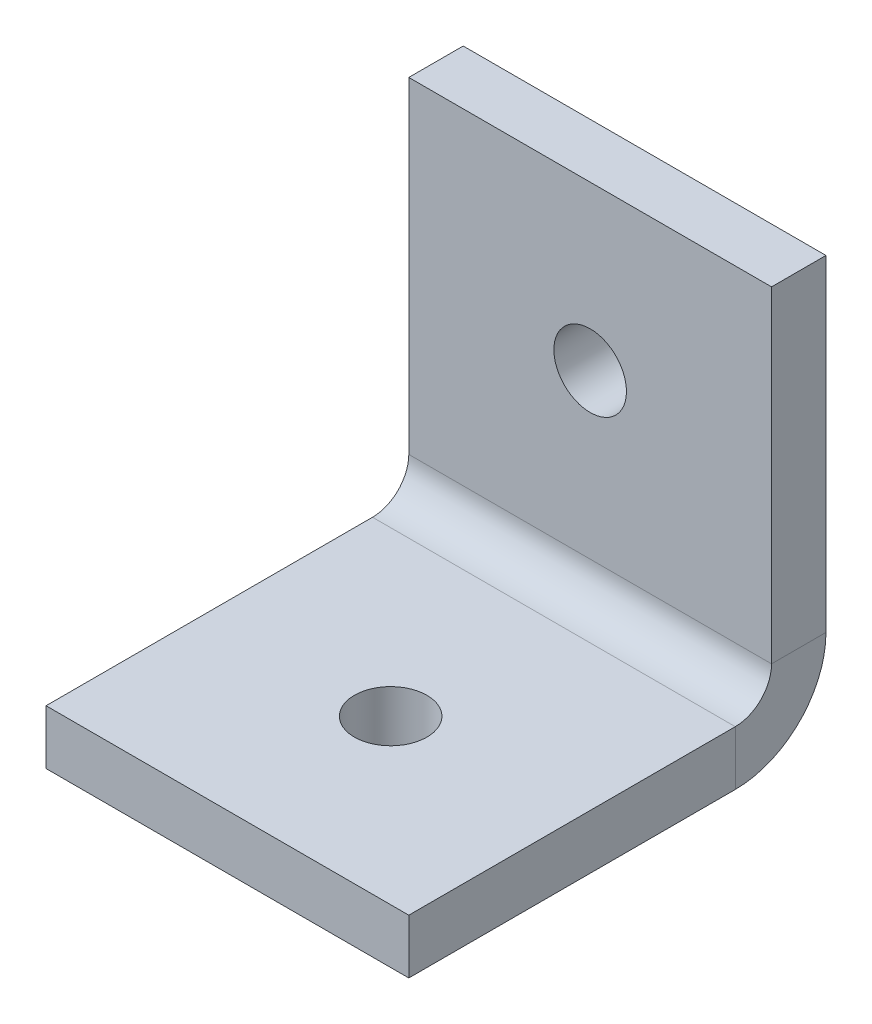
ISO-10303-21;
HEADER;
FILE_DESCRIPTION(('STEP AP214'),'2;1');
FILE_NAME('part.step','',(''),(''),'','','');
FILE_SCHEMA(('AUTOMOTIVE_DESIGN { 1 0 10303 214 1 1 1 1 }'));
ENDSEC;
DATA;
#1=APPLICATION_CONTEXT('core data for automotive mechanical design processes');
#2=APPLICATION_PROTOCOL_DEFINITION('international standard','automotive_design',2000,#1);
#3=PRODUCT_CONTEXT('',#1,'mechanical');
#4=PRODUCT('Part','Part','',(#3));
#5=PRODUCT_RELATED_PRODUCT_CATEGORY('part','',(#4));
#6=PRODUCT_DEFINITION_FORMATION('','',#4);
#7=PRODUCT_DEFINITION_CONTEXT('part definition',#1,'design');
#8=PRODUCT_DEFINITION('design','',#6,#7);
#9=PRODUCT_DEFINITION_SHAPE('','',#8);
#10=(LENGTH_UNIT() NAMED_UNIT(*) SI_UNIT(.MILLI.,.METRE.));
#11=(NAMED_UNIT(*) PLANE_ANGLE_UNIT() SI_UNIT($,.RADIAN.));
#12=(NAMED_UNIT(*) SI_UNIT($,.STERADIAN.) SOLID_ANGLE_UNIT());
#13=UNCERTAINTY_MEASURE_WITH_UNIT(LENGTH_MEASURE(1.E-05),#10,'distance_accuracy_value','');
#14=(GEOMETRIC_REPRESENTATION_CONTEXT(3) GLOBAL_UNCERTAINTY_ASSIGNED_CONTEXT((#13)) GLOBAL_UNIT_ASSIGNED_CONTEXT((#10,
#11,#12)) REPRESENTATION_CONTEXT('',''));
#15=CARTESIAN_POINT('',(0.,0.,0.));
#16=DIRECTION('',(0.,0.,1.));
#17=DIRECTION('',(1.,0.,0.));
#18=AXIS2_PLACEMENT_3D('',#15,#16,#17);
#19=CARTESIAN_POINT('',(20.,2.,0.));
#20=DIRECTION('',(1.,0.,0.));
#21=DIRECTION('',(0.,0.,-1.));
#22=AXIS2_PLACEMENT_3D('',#19,#20,#21);
#23=PLANE('',#22);
#24=DIRECTION('',(0.,0.,-1.));
#25=VECTOR('',#24,1.);
#26=CARTESIAN_POINT('',(20.,2.,0.));
#27=LINE('',#26,#25);
#28=CARTESIAN_POINT('',(20.,2.,0.));
#29=VERTEX_POINT('',#28);
#30=CARTESIAN_POINT('',(20.,2.,-3.));
#31=VERTEX_POINT('',#30);
#32=EDGE_CURVE('E11',#29,#31,#27,.T.);
#33=ORIENTED_EDGE('',*,*,#32,.F.);
#34=CARTESIAN_POINT('',(20.,2.,2.));
#35=DIRECTION('',(1.,0.,0.));
#36=DIRECTION('',(0.,0.,-1.));
#37=AXIS2_PLACEMENT_3D('',#34,#35,#36);
#38=CIRCLE('',#37,2.);
#39=CARTESIAN_POINT('',(20.,0.,2.));
#40=VERTEX_POINT('',#39);
#41=EDGE_CURVE('E129',#29,#40,#38,.F.);
#42=ORIENTED_EDGE('',*,*,#41,.T.);
#43=DIRECTION('',(0.,1.,0.));
#44=VECTOR('',#43,1.);
#45=CARTESIAN_POINT('',(20.,-3.,2.));
#46=LINE('',#45,#44);
#47=CARTESIAN_POINT('',(20.,-3.,2.));
#48=VERTEX_POINT('',#47);
#49=EDGE_CURVE('E47',#48,#40,#46,.T.);
#50=ORIENTED_EDGE('',*,*,#49,.F.);
#51=CARTESIAN_POINT('',(20.,2.,2.));
#52=DIRECTION('',(1.,0.,0.));
#53=DIRECTION('',(0.,0.,-1.));
#54=AXIS2_PLACEMENT_3D('',#51,#52,#53);
#55=CIRCLE('',#54,5.);
#56=EDGE_CURVE('E136',#31,#48,#55,.F.);
#57=ORIENTED_EDGE('',*,*,#56,.F.);
#58=EDGE_LOOP('',(#33,#42,#50,#57));
#59=FACE_BOUND('',#58,.T.);
#60=ADVANCED_FACE('F39',(#59),#23,.T.);
#61=CARTESIAN_POINT('',(20.,-3.,2.));
#62=DIRECTION('',(1.,0.,0.));
#63=DIRECTION('',(0.,0.,-1.));
#64=AXIS2_PLACEMENT_3D('',#61,#62,#63);
#65=PLANE('',#64);
#66=DIRECTION('',(0.,-1.,0.));
#67=VECTOR('',#66,1.);
#68=CARTESIAN_POINT('',(20.,20.,0.));
#69=LINE('',#68,#67);
#70=CARTESIAN_POINT('',(20.,20.,0.));
#71=VERTEX_POINT('',#70);
#72=EDGE_CURVE('E124',#71,#29,#69,.T.);
#73=ORIENTED_EDGE('',*,*,#72,.T.);
#74=ORIENTED_EDGE('',*,*,#32,.T.);
#75=DIRECTION('',(0.,-1.,0.));
#76=VECTOR('',#75,1.);
#77=CARTESIAN_POINT('',(20.,20.,-3.));
#78=LINE('',#77,#76);
#79=CARTESIAN_POINT('',(20.,20.,-3.));
#80=VERTEX_POINT('',#79);
#81=EDGE_CURVE('E134',#80,#31,#78,.T.);
#82=ORIENTED_EDGE('',*,*,#81,.F.);
#83=DIRECTION('',(0.,0.,-1.));
#84=VECTOR('',#83,1.);
#85=CARTESIAN_POINT('',(20.,20.,0.));
#86=LINE('',#85,#84);
#87=EDGE_CURVE('E115',#71,#80,#86,.T.);
#88=ORIENTED_EDGE('',*,*,#87,.F.);
#89=EDGE_LOOP('',(#73,#74,#82,#88));
#90=FACE_BOUND('',#89,.T.);
#91=ADVANCED_FACE('F132',(#90),#65,.T.);
#92=CARTESIAN_POINT('',(0.,0.,2.));
#93=DIRECTION('',(-1.,0.,0.));
#94=DIRECTION('',(0.,0.,1.));
#95=AXIS2_PLACEMENT_3D('',#92,#93,#94);
#96=PLANE('',#95);
#97=DIRECTION('',(0.,-1.,0.));
#98=VECTOR('',#97,1.);
#99=CARTESIAN_POINT('',(0.,0.,2.));
#100=LINE('',#99,#98);
#101=CARTESIAN_POINT('',(0.,0.,2.));
#102=VERTEX_POINT('',#101);
#103=CARTESIAN_POINT('',(0.,-3.,2.));
#104=VERTEX_POINT('',#103);
#105=EDGE_CURVE('E90',#102,#104,#100,.T.);
#106=ORIENTED_EDGE('',*,*,#105,.F.);
#107=CARTESIAN_POINT('',(0.,2.,2.));
#108=DIRECTION('',(1.,0.,0.));
#109=DIRECTION('',(0.,0.,-1.));
#110=AXIS2_PLACEMENT_3D('',#107,#108,#109);
#111=CIRCLE('',#110,2.);
#112=CARTESIAN_POINT('',(0.,2.,0.));
#113=VERTEX_POINT('',#112);
#114=EDGE_CURVE('E159',#113,#102,#111,.F.);
#115=ORIENTED_EDGE('',*,*,#114,.F.);
#116=DIRECTION('',(0.,0.,1.));
#117=VECTOR('',#116,1.);
#118=CARTESIAN_POINT('',(0.,2.,-3.));
#119=LINE('',#118,#117);
#120=CARTESIAN_POINT('',(0.,2.,-3.));
#121=VERTEX_POINT('',#120);
#122=EDGE_CURVE('E83',#121,#113,#119,.T.);
#123=ORIENTED_EDGE('',*,*,#122,.F.);
#124=CARTESIAN_POINT('',(0.,2.,2.));
#125=DIRECTION('',(1.,0.,0.));
#126=DIRECTION('',(0.,0.,-1.));
#127=AXIS2_PLACEMENT_3D('',#124,#125,#126);
#128=CIRCLE('',#127,5.);
#129=EDGE_CURVE('E152',#121,#104,#128,.F.);
#130=ORIENTED_EDGE('',*,*,#129,.T.);
#131=EDGE_LOOP('',(#106,#115,#123,#130));
#132=FACE_BOUND('',#131,.T.);
#133=ADVANCED_FACE('F191',(#132),#96,.T.);
#134=CARTESIAN_POINT('',(0.,2.,-3.));
#135=DIRECTION('',(-1.,0.,0.));
#136=DIRECTION('',(0.,0.,1.));
#137=AXIS2_PLACEMENT_3D('',#134,#135,#136);
#138=PLANE('',#137);
#139=DIRECTION('',(0.,0.,1.));
#140=VECTOR('',#139,1.);
#141=CARTESIAN_POINT('',(0.,0.,0.));
#142=LINE('',#141,#140);
#143=CARTESIAN_POINT('',(0.,0.,20.));
#144=VERTEX_POINT('',#143);
#145=EDGE_CURVE('E142',#102,#144,#142,.T.);
#146=ORIENTED_EDGE('',*,*,#145,.F.);
#147=ORIENTED_EDGE('',*,*,#105,.T.);
#148=DIRECTION('',(0.,0.,-1.));
#149=VECTOR('',#148,1.);
#150=CARTESIAN_POINT('',(0.,-3.,0.));
#151=LINE('',#150,#149);
#152=CARTESIAN_POINT('',(0.,-3.,20.));
#153=VERTEX_POINT('',#152);
#154=EDGE_CURVE('E149',#104,#153,#151,.F.);
#155=ORIENTED_EDGE('',*,*,#154,.T.);
#156=DIRECTION('',(0.,1.,0.));
#157=VECTOR('',#156,1.);
#158=CARTESIAN_POINT('',(0.,-3.,20.));
#159=LINE('',#158,#157);
#160=EDGE_CURVE('E145',#153,#144,#159,.T.);
#161=ORIENTED_EDGE('',*,*,#160,.T.);
#162=EDGE_LOOP('',(#146,#147,#155,#161));
#163=FACE_BOUND('',#162,.T.);
#164=ADVANCED_FACE('F178',(#163),#138,.T.);
#165=CARTESIAN_POINT('',(20.,0.,0.));
#166=DIRECTION('',(0.,-1.,0.));
#167=DIRECTION('',(0.,0.,-1.));
#168=AXIS2_PLACEMENT_3D('',#165,#166,#167);
#169=PLANE('',#168);
#170=CARTESIAN_POINT('',(10.,0.,11.));
#171=DIRECTION('',(0.,-1.,0.));
#172=DIRECTION('',(0.,0.,-1.));
#173=AXIS2_PLACEMENT_3D('',#170,#171,#172);
#174=CIRCLE('',#173,2.);
#175=CARTESIAN_POINT('',(10.,0.,9.));
#176=VERTEX_POINT('',#175);
#177=EDGE_CURVE('E206',#176,#176,#174,.T.);
#178=ORIENTED_EDGE('',*,*,#177,.T.);
#179=EDGE_LOOP('',(#178));
#180=FACE_BOUND('',#179,.T.);
#181=ORIENTED_EDGE('',*,*,#145,.T.);
#182=DIRECTION('',(-1.,0.,0.));
#183=VECTOR('',#182,1.);
#184=CARTESIAN_POINT('',(20.,0.,20.));
#185=LINE('',#184,#183);
#186=CARTESIAN_POINT('',(20.,0.,20.));
#187=VERTEX_POINT('',#186);
#188=EDGE_CURVE('E173',#187,#144,#185,.T.);
#189=ORIENTED_EDGE('',*,*,#188,.F.);
#190=DIRECTION('',(0.,0.,1.));
#191=VECTOR('',#190,1.);
#192=CARTESIAN_POINT('',(20.,0.,0.));
#193=LINE('',#192,#191);
#194=EDGE_CURVE('E96',#40,#187,#193,.T.);
#195=ORIENTED_EDGE('',*,*,#194,.F.);
#196=DIRECTION('',(-1.,0.,0.));
#197=VECTOR('',#196,1.);
#198=CARTESIAN_POINT('',(20.,0.,2.));
#199=LINE('',#198,#197);
#200=EDGE_CURVE('E141',#40,#102,#199,.T.);
#201=ORIENTED_EDGE('',*,*,#200,.T.);
#202=EDGE_LOOP('',(#181,#189,#195,#201));
#203=FACE_BOUND('',#202,.T.);
#204=ADVANCED_FACE('F215',(#180,#203),#169,.F.);
#205=CARTESIAN_POINT('',(20.,-3.,20.));
#206=DIRECTION('',(0.,0.,1.));
#207=DIRECTION('',(1.,0.,0.));
#208=AXIS2_PLACEMENT_3D('',#205,#206,#207);
#209=PLANE('',#208);
#210=ORIENTED_EDGE('',*,*,#160,.F.);
#211=DIRECTION('',(-1.,0.,0.));
#212=VECTOR('',#211,1.);
#213=CARTESIAN_POINT('',(20.,-3.,20.));
#214=LINE('',#213,#212);
#215=CARTESIAN_POINT('',(20.,-3.,20.));
#216=VERTEX_POINT('',#215);
#217=EDGE_CURVE('E171',#216,#153,#214,.T.);
#218=ORIENTED_EDGE('',*,*,#217,.F.);
#219=DIRECTION('',(0.,1.,0.));
#220=VECTOR('',#219,1.);
#221=CARTESIAN_POINT('',(20.,-3.,20.));
#222=LINE('',#221,#220);
#223=EDGE_CURVE('E197',#216,#187,#222,.T.);
#224=ORIENTED_EDGE('',*,*,#223,.T.);
#225=ORIENTED_EDGE('',*,*,#188,.T.);
#226=EDGE_LOOP('',(#210,#218,#224,#225));
#227=FACE_BOUND('',#226,.T.);
#228=ADVANCED_FACE('F226',(#227),#209,.T.);
#229=CARTESIAN_POINT('',(20.,-3.,0.));
#230=DIRECTION('',(0.,-1.,0.));
#231=DIRECTION('',(0.,0.,-1.));
#232=AXIS2_PLACEMENT_3D('',#229,#230,#231);
#233=PLANE('',#232);
#234=CARTESIAN_POINT('',(10.,-3.,11.));
#235=DIRECTION('',(0.,-1.,0.));
#236=DIRECTION('',(0.,0.,-1.));
#237=AXIS2_PLACEMENT_3D('',#234,#235,#236);
#238=CIRCLE('',#237,2.);
#239=CARTESIAN_POINT('',(10.,-3.,9.));
#240=VERTEX_POINT('',#239);
#241=EDGE_CURVE('E209',#240,#240,#238,.T.);
#242=ORIENTED_EDGE('',*,*,#241,.F.);
#243=EDGE_LOOP('',(#242));
#244=FACE_BOUND('',#243,.T.);
#245=ORIENTED_EDGE('',*,*,#154,.F.);
#246=DIRECTION('',(-1.,0.,0.));
#247=VECTOR('',#246,1.);
#248=CARTESIAN_POINT('',(20.,-3.,2.));
#249=LINE('',#248,#247);
#250=EDGE_CURVE('E168',#48,#104,#249,.T.);
#251=ORIENTED_EDGE('',*,*,#250,.F.);
#252=DIRECTION('',(0.,0.,-1.));
#253=VECTOR('',#252,1.);
#254=CARTESIAN_POINT('',(20.,-3.,0.));
#255=LINE('',#254,#253);
#256=EDGE_CURVE('E196',#48,#216,#255,.F.);
#257=ORIENTED_EDGE('',*,*,#256,.T.);
#258=ORIENTED_EDGE('',*,*,#217,.T.);
#259=EDGE_LOOP('',(#245,#251,#257,#258));
#260=FACE_BOUND('',#259,.T.);
#261=ADVANCED_FACE('F189',(#244,#260),#233,.T.);
#262=CARTESIAN_POINT('',(20.,2.,2.));
#263=DIRECTION('',(-1.,0.,0.));
#264=DIRECTION('',(0.,0.,1.));
#265=AXIS2_PLACEMENT_3D('',#262,#263,#264);
#266=CYLINDRICAL_SURFACE('',#265,5.);
#267=ORIENTED_EDGE('',*,*,#129,.F.);
#268=DIRECTION('',(-1.,0.,0.));
#269=VECTOR('',#268,1.);
#270=CARTESIAN_POINT('',(20.,2.,-3.));
#271=LINE('',#270,#269);
#272=EDGE_CURVE('E165',#31,#121,#271,.T.);
#273=ORIENTED_EDGE('',*,*,#272,.F.);
#274=ORIENTED_EDGE('',*,*,#56,.T.);
#275=ORIENTED_EDGE('',*,*,#250,.T.);
#276=EDGE_LOOP('',(#267,#273,#274,#275));
#277=FACE_BOUND('',#276,.T.);
#278=ADVANCED_FACE('F184',(#277),#266,.T.);
#279=CARTESIAN_POINT('',(20.,20.,-3.));
#280=DIRECTION('',(0.,0.,-1.));
#281=DIRECTION('',(0.,1.,0.));
#282=AXIS2_PLACEMENT_3D('',#279,#280,#281);
#283=PLANE('',#282);
#284=CARTESIAN_POINT('',(10.,11.,-3.));
#285=DIRECTION('',(0.,0.,-1.));
#286=DIRECTION('',(0.,1.,0.));
#287=AXIS2_PLACEMENT_3D('',#284,#285,#286);
#288=CIRCLE('',#287,2.);
#289=CARTESIAN_POINT('',(10.,13.,-3.));
#290=VERTEX_POINT('',#289);
#291=EDGE_CURVE('E203',#290,#290,#288,.T.);
#292=ORIENTED_EDGE('',*,*,#291,.F.);
#293=EDGE_LOOP('',(#292));
#294=FACE_BOUND('',#293,.T.);
#295=DIRECTION('',(0.,-1.,0.));
#296=VECTOR('',#295,1.);
#297=CARTESIAN_POINT('',(0.,20.,-3.));
#298=LINE('',#297,#296);
#299=CARTESIAN_POINT('',(0.,20.,-3.));
#300=VERTEX_POINT('',#299);
#301=EDGE_CURVE('E154',#300,#121,#298,.T.);
#302=ORIENTED_EDGE('',*,*,#301,.F.);
#303=DIRECTION('',(-1.,0.,0.));
#304=VECTOR('',#303,1.);
#305=CARTESIAN_POINT('',(20.,20.,-3.));
#306=LINE('',#305,#304);
#307=EDGE_CURVE('E119',#80,#300,#306,.T.);
#308=ORIENTED_EDGE('',*,*,#307,.F.);
#309=ORIENTED_EDGE('',*,*,#81,.T.);
#310=ORIENTED_EDGE('',*,*,#272,.T.);
#311=EDGE_LOOP('',(#302,#308,#309,#310));
#312=FACE_BOUND('',#311,.T.);
#313=ADVANCED_FACE('F194',(#294,#312),#283,.T.);
#314=CARTESIAN_POINT('',(20.,20.,0.));
#315=DIRECTION('',(0.,1.,0.));
#316=DIRECTION('',(0.,0.,1.));
#317=AXIS2_PLACEMENT_3D('',#314,#315,#316);
#318=PLANE('',#317);
#319=DIRECTION('',(0.,0.,-1.));
#320=VECTOR('',#319,1.);
#321=CARTESIAN_POINT('',(0.,20.,0.));
#322=LINE('',#321,#320);
#323=CARTESIAN_POINT('',(0.,20.,0.));
#324=VERTEX_POINT('',#323);
#325=EDGE_CURVE('E117',#324,#300,#322,.T.);
#326=ORIENTED_EDGE('',*,*,#325,.F.);
#327=DIRECTION('',(-1.,0.,0.));
#328=VECTOR('',#327,1.);
#329=CARTESIAN_POINT('',(20.,20.,0.));
#330=LINE('',#329,#328);
#331=EDGE_CURVE('E111',#71,#324,#330,.T.);
#332=ORIENTED_EDGE('',*,*,#331,.F.);
#333=ORIENTED_EDGE('',*,*,#87,.T.);
#334=ORIENTED_EDGE('',*,*,#307,.T.);
#335=EDGE_LOOP('',(#326,#332,#333,#334));
#336=FACE_BOUND('',#335,.T.);
#337=ADVANCED_FACE('F113',(#336),#318,.T.);
#338=CARTESIAN_POINT('',(20.,20.,0.));
#339=DIRECTION('',(0.,0.,-1.));
#340=DIRECTION('',(0.,1.,0.));
#341=AXIS2_PLACEMENT_3D('',#338,#339,#340);
#342=PLANE('',#341);
#343=CARTESIAN_POINT('',(10.,11.,0.));
#344=DIRECTION('',(0.,0.,-1.));
#345=DIRECTION('',(0.,1.,0.));
#346=AXIS2_PLACEMENT_3D('',#343,#344,#345);
#347=CIRCLE('',#346,2.);
#348=CARTESIAN_POINT('',(10.,13.,0.));
#349=VERTEX_POINT('',#348);
#350=EDGE_CURVE('E146',#349,#349,#347,.T.);
#351=ORIENTED_EDGE('',*,*,#350,.T.);
#352=EDGE_LOOP('',(#351));
#353=FACE_BOUND('',#352,.T.);
#354=DIRECTION('',(0.,-1.,0.));
#355=VECTOR('',#354,1.);
#356=CARTESIAN_POINT('',(0.,20.,0.));
#357=LINE('',#356,#355);
#358=EDGE_CURVE('E157',#324,#113,#357,.T.);
#359=ORIENTED_EDGE('',*,*,#358,.T.);
#360=DIRECTION('',(-1.,0.,0.));
#361=VECTOR('',#360,1.);
#362=CARTESIAN_POINT('',(20.,2.,0.));
#363=LINE('',#362,#361);
#364=EDGE_CURVE('E120',#29,#113,#363,.T.);
#365=ORIENTED_EDGE('',*,*,#364,.F.);
#366=ORIENTED_EDGE('',*,*,#72,.F.);
#367=ORIENTED_EDGE('',*,*,#331,.T.);
#368=EDGE_LOOP('',(#359,#365,#366,#367));
#369=FACE_BOUND('',#368,.T.);
#370=ADVANCED_FACE('F125',(#353,#369),#342,.F.);
#371=CARTESIAN_POINT('',(20.,2.,2.));
#372=DIRECTION('',(-1.,0.,0.));
#373=DIRECTION('',(0.,0.,1.));
#374=AXIS2_PLACEMENT_3D('',#371,#372,#373);
#375=CYLINDRICAL_SURFACE('',#374,2.);
#376=ORIENTED_EDGE('',*,*,#114,.T.);
#377=ORIENTED_EDGE('',*,*,#200,.F.);
#378=ORIENTED_EDGE('',*,*,#41,.F.);
#379=ORIENTED_EDGE('',*,*,#364,.T.);
#380=EDGE_LOOP('',(#376,#377,#378,#379));
#381=FACE_BOUND('',#380,.T.);
#382=ADVANCED_FACE('F286',(#381),#375,.F.);
#383=CARTESIAN_POINT('',(20.,2.,2.));
#384=DIRECTION('',(1.,0.,0.));
#385=DIRECTION('',(0.,0.,-1.));
#386=AXIS2_PLACEMENT_3D('',#383,#384,#385);
#387=PLANE('',#386);
#388=ORIENTED_EDGE('',*,*,#194,.T.);
#389=ORIENTED_EDGE('',*,*,#223,.F.);
#390=ORIENTED_EDGE('',*,*,#256,.F.);
#391=ORIENTED_EDGE('',*,*,#49,.T.);
#392=EDGE_LOOP('',(#388,#389,#390,#391));
#393=FACE_BOUND('',#392,.T.);
#394=ADVANCED_FACE('F291',(#393),#387,.T.);
#395=CARTESIAN_POINT('',(0.,2.,2.));
#396=DIRECTION('',(1.,0.,0.));
#397=DIRECTION('',(0.,0.,-1.));
#398=AXIS2_PLACEMENT_3D('',#395,#396,#397);
#399=PLANE('',#398);
#400=ORIENTED_EDGE('',*,*,#301,.T.);
#401=ORIENTED_EDGE('',*,*,#122,.T.);
#402=ORIENTED_EDGE('',*,*,#358,.F.);
#403=ORIENTED_EDGE('',*,*,#325,.T.);
#404=EDGE_LOOP('',(#400,#401,#402,#403));
#405=FACE_BOUND('',#404,.T.);
#406=ADVANCED_FACE('F302',(#405),#399,.F.);
#407=CARTESIAN_POINT('',(10.,11.,0.));
#408=DIRECTION('',(0.,0.,-1.));
#409=DIRECTION('',(0.,1.,0.));
#410=AXIS2_PLACEMENT_3D('',#407,#408,#409);
#411=CYLINDRICAL_SURFACE('',#410,2.);
#412=ORIENTED_EDGE('',*,*,#350,.F.);
#413=EDGE_LOOP('',(#412));
#414=FACE_BOUND('',#413,.T.);
#415=ORIENTED_EDGE('',*,*,#291,.T.);
#416=EDGE_LOOP('',(#415));
#417=FACE_BOUND('',#416,.T.);
#418=ADVANCED_FACE('F221',(#414,#417),#411,.F.);
#419=CARTESIAN_POINT('',(10.,0.,11.));
#420=DIRECTION('',(0.,-1.,0.));
#421=DIRECTION('',(0.,0.,-1.));
#422=AXIS2_PLACEMENT_3D('',#419,#420,#421);
#423=CYLINDRICAL_SURFACE('',#422,2.);
#424=ORIENTED_EDGE('',*,*,#177,.F.);
#425=EDGE_LOOP('',(#424));
#426=FACE_BOUND('',#425,.T.);
#427=ORIENTED_EDGE('',*,*,#241,.T.);
#428=EDGE_LOOP('',(#427));
#429=FACE_BOUND('',#428,.T.);
#430=ADVANCED_FACE('F218',(#426,#429),#423,.F.);
#431=CLOSED_SHELL('',(#60,#91,#133,#164,#204,#228,#261,#278,#313,#337,#370,#382,#394,#406,#418,#430));
#432=MANIFOLD_SOLID_BREP('B2',#431);
#433=ADVANCED_BREP_SHAPE_REPRESENTATION('',(#18,#432),#14);
#434=SHAPE_DEFINITION_REPRESENTATION(#9,#433);
ENDSEC;
END-ISO-10303-21;
